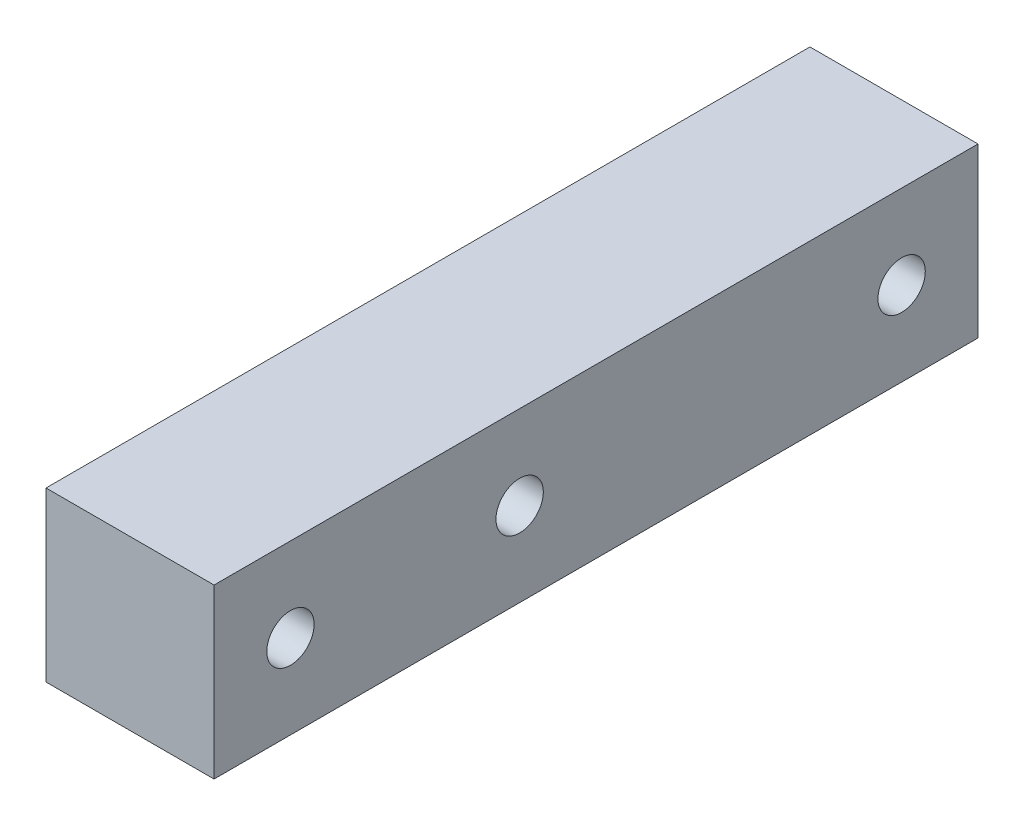
ISO-10303-21;
HEADER;
FILE_DESCRIPTION(('STEP AP214'),'2;1');
FILE_NAME('part.step','',(''),(''),'','','');
FILE_SCHEMA(('AUTOMOTIVE_DESIGN { 1 0 10303 214 1 1 1 1 }'));
ENDSEC;
DATA;
#1=APPLICATION_CONTEXT('core data for automotive mechanical design processes');
#2=APPLICATION_PROTOCOL_DEFINITION('international standard','automotive_design',2000,#1);
#3=PRODUCT_CONTEXT('',#1,'mechanical');
#4=PRODUCT('Part','Part','',(#3));
#5=PRODUCT_RELATED_PRODUCT_CATEGORY('part','',(#4));
#6=PRODUCT_DEFINITION_FORMATION('','',#4);
#7=PRODUCT_DEFINITION_CONTEXT('part definition',#1,'design');
#8=PRODUCT_DEFINITION('design','',#6,#7);
#9=PRODUCT_DEFINITION_SHAPE('','',#8);
#10=(LENGTH_UNIT() NAMED_UNIT(*) SI_UNIT(.MILLI.,.METRE.));
#11=(NAMED_UNIT(*) PLANE_ANGLE_UNIT() SI_UNIT($,.RADIAN.));
#12=(NAMED_UNIT(*) SI_UNIT($,.STERADIAN.) SOLID_ANGLE_UNIT());
#13=UNCERTAINTY_MEASURE_WITH_UNIT(LENGTH_MEASURE(1.E-05),#10,'distance_accuracy_value','');
#14=(GEOMETRIC_REPRESENTATION_CONTEXT(3) GLOBAL_UNCERTAINTY_ASSIGNED_CONTEXT((#13)) GLOBAL_UNIT_ASSIGNED_CONTEXT((#10,
#11,#12)) REPRESENTATION_CONTEXT('',''));
#15=CARTESIAN_POINT('',(0.,0.,0.));
#16=DIRECTION('',(0.,0.,1.));
#17=DIRECTION('',(1.,0.,0.));
#18=AXIS2_PLACEMENT_3D('',#15,#16,#17);
#19=CARTESIAN_POINT('',(13.97,0.,0.));
#20=DIRECTION('',(0.,0.,-1.));
#21=DIRECTION('',(-1.,0.,0.));
#22=AXIS2_PLACEMENT_3D('',#19,#20,#21);
#23=PLANE('',#22);
#24=DIRECTION('',(0.,-1.,0.));
#25=VECTOR('',#24,1.);
#26=CARTESIAN_POINT('',(0.,0.,0.));
#27=LINE('',#26,#25);
#28=CARTESIAN_POINT('',(0.,13.97,0.));
#29=VERTEX_POINT('',#28);
#30=CARTESIAN_POINT('',(0.,0.,0.));
#31=VERTEX_POINT('',#30);
#32=EDGE_CURVE('E99',#29,#31,#27,.T.);
#33=ORIENTED_EDGE('',*,*,#32,.T.);
#34=DIRECTION('',(-1.,0.,0.));
#35=VECTOR('',#34,1.);
#36=CARTESIAN_POINT('',(13.97,0.,0.));
#37=LINE('',#36,#35);
#38=CARTESIAN_POINT('',(13.97,0.,0.));
#39=VERTEX_POINT('',#38);
#40=EDGE_CURVE('E11',#39,#31,#37,.T.);
#41=ORIENTED_EDGE('',*,*,#40,.F.);
#42=DIRECTION('',(0.,-1.,0.));
#43=VECTOR('',#42,1.);
#44=CARTESIAN_POINT('',(13.97,0.,0.));
#45=LINE('',#44,#43);
#46=CARTESIAN_POINT('',(13.97,13.97,0.));
#47=VERTEX_POINT('',#46);
#48=EDGE_CURVE('E86',#47,#39,#45,.T.);
#49=ORIENTED_EDGE('',*,*,#48,.F.);
#50=DIRECTION('',(-1.,0.,0.));
#51=VECTOR('',#50,1.);
#52=CARTESIAN_POINT('',(13.97,13.97,0.));
#53=LINE('',#52,#51);
#54=EDGE_CURVE('E95',#47,#29,#53,.T.);
#55=ORIENTED_EDGE('',*,*,#54,.T.);
#56=EDGE_LOOP('',(#33,#41,#49,#55));
#57=FACE_BOUND('',#56,.T.);
#58=ADVANCED_FACE('F33',(#57),#23,.F.);
#59=CARTESIAN_POINT('',(13.97,0.,0.));
#60=DIRECTION('',(0.,1.,0.));
#61=DIRECTION('',(0.,0.,1.));
#62=AXIS2_PLACEMENT_3D('',#59,#60,#61);
#63=PLANE('',#62);
#64=DIRECTION('',(0.,0.,-1.));
#65=VECTOR('',#64,1.);
#66=CARTESIAN_POINT('',(0.,0.,0.));
#67=LINE('',#66,#65);
#68=CARTESIAN_POINT('',(0.,0.,-63.5));
#69=VERTEX_POINT('',#68);
#70=EDGE_CURVE('E90',#31,#69,#67,.T.);
#71=ORIENTED_EDGE('',*,*,#70,.T.);
#72=DIRECTION('',(-1.,0.,0.));
#73=VECTOR('',#72,1.);
#74=CARTESIAN_POINT('',(13.97,0.,-63.5));
#75=LINE('',#74,#73);
#76=CARTESIAN_POINT('',(13.97,0.,-63.5));
#77=VERTEX_POINT('',#76);
#78=EDGE_CURVE('E42',#77,#69,#75,.T.);
#79=ORIENTED_EDGE('',*,*,#78,.F.);
#80=DIRECTION('',(0.,0.,-1.));
#81=VECTOR('',#80,1.);
#82=CARTESIAN_POINT('',(13.97,0.,0.));
#83=LINE('',#82,#81);
#84=EDGE_CURVE('E81',#39,#77,#83,.T.);
#85=ORIENTED_EDGE('',*,*,#84,.F.);
#86=ORIENTED_EDGE('',*,*,#40,.T.);
#87=EDGE_LOOP('',(#71,#79,#85,#86));
#88=FACE_BOUND('',#87,.T.);
#89=ADVANCED_FACE('F89',(#88),#63,.F.);
#90=CARTESIAN_POINT('',(13.97,0.,-63.5));
#91=DIRECTION('',(0.,0.,1.));
#92=DIRECTION('',(1.,0.,0.));
#93=AXIS2_PLACEMENT_3D('',#90,#91,#92);
#94=PLANE('',#93);
#95=DIRECTION('',(0.,1.,0.));
#96=VECTOR('',#95,1.);
#97=CARTESIAN_POINT('',(0.,0.,-63.5));
#98=LINE('',#97,#96);
#99=CARTESIAN_POINT('',(0.,13.97,-63.5));
#100=VERTEX_POINT('',#99);
#101=EDGE_CURVE('E68',#69,#100,#98,.T.);
#102=ORIENTED_EDGE('',*,*,#101,.T.);
#103=DIRECTION('',(-1.,0.,0.));
#104=VECTOR('',#103,1.);
#105=CARTESIAN_POINT('',(13.97,13.97,-63.5));
#106=LINE('',#105,#104);
#107=CARTESIAN_POINT('',(13.97,13.97,-63.5));
#108=VERTEX_POINT('',#107);
#109=EDGE_CURVE('E91',#108,#100,#106,.T.);
#110=ORIENTED_EDGE('',*,*,#109,.F.);
#111=DIRECTION('',(0.,1.,0.));
#112=VECTOR('',#111,1.);
#113=CARTESIAN_POINT('',(13.97,0.,-63.5));
#114=LINE('',#113,#112);
#115=EDGE_CURVE('E84',#77,#108,#114,.T.);
#116=ORIENTED_EDGE('',*,*,#115,.F.);
#117=ORIENTED_EDGE('',*,*,#78,.T.);
#118=EDGE_LOOP('',(#102,#110,#116,#117));
#119=FACE_BOUND('',#118,.T.);
#120=ADVANCED_FACE('F93',(#119),#94,.F.);
#121=CARTESIAN_POINT('',(13.97,13.97,0.));
#122=DIRECTION('',(0.,-1.,0.));
#123=DIRECTION('',(0.,0.,-1.));
#124=AXIS2_PLACEMENT_3D('',#121,#122,#123);
#125=PLANE('',#124);
#126=DIRECTION('',(0.,0.,1.));
#127=VECTOR('',#126,1.);
#128=CARTESIAN_POINT('',(0.,13.97,0.));
#129=LINE('',#128,#127);
#130=EDGE_CURVE('E74',#100,#29,#129,.T.);
#131=ORIENTED_EDGE('',*,*,#130,.T.);
#132=ORIENTED_EDGE('',*,*,#54,.F.);
#133=DIRECTION('',(0.,0.,1.));
#134=VECTOR('',#133,1.);
#135=CARTESIAN_POINT('',(13.97,13.97,0.));
#136=LINE('',#135,#134);
#137=EDGE_CURVE('E51',#108,#47,#136,.T.);
#138=ORIENTED_EDGE('',*,*,#137,.F.);
#139=ORIENTED_EDGE('',*,*,#109,.T.);
#140=EDGE_LOOP('',(#131,#132,#138,#139));
#141=FACE_BOUND('',#140,.T.);
#142=ADVANCED_FACE('F132',(#141),#125,.F.);
#143=CARTESIAN_POINT('',(13.97,0.,0.));
#144=DIRECTION('',(-1.,0.,0.));
#145=DIRECTION('',(0.,0.,1.));
#146=AXIS2_PLACEMENT_3D('',#143,#144,#145);
#147=PLANE('',#146);
#148=CARTESIAN_POINT('',(13.97,6.985,-25.4));
#149=DIRECTION('',(1.,0.,0.));
#150=DIRECTION('',(0.,0.,-1.));
#151=AXIS2_PLACEMENT_3D('',#148,#149,#150);
#152=CIRCLE('',#151,1.9685);
#153=CARTESIAN_POINT('',(13.97,6.985,-27.3685));
#154=VERTEX_POINT('',#153);
#155=EDGE_CURVE('E122',#154,#154,#152,.T.);
#156=ORIENTED_EDGE('',*,*,#155,.F.);
#157=EDGE_LOOP('',(#156));
#158=FACE_BOUND('',#157,.T.);
#159=CARTESIAN_POINT('',(13.97,6.985,-57.15));
#160=DIRECTION('',(1.,0.,0.));
#161=DIRECTION('',(0.,0.,-1.));
#162=AXIS2_PLACEMENT_3D('',#159,#160,#161);
#163=CIRCLE('',#162,1.9685);
#164=CARTESIAN_POINT('',(13.97,6.985,-59.1185));
#165=VERTEX_POINT('',#164);
#166=EDGE_CURVE('E112',#165,#165,#163,.T.);
#167=ORIENTED_EDGE('',*,*,#166,.F.);
#168=EDGE_LOOP('',(#167));
#169=FACE_BOUND('',#168,.T.);
#170=CARTESIAN_POINT('',(13.97,6.985,-6.35));
#171=DIRECTION('',(1.,0.,0.));
#172=DIRECTION('',(0.,0.,-1.));
#173=AXIS2_PLACEMENT_3D('',#170,#171,#172);
#174=CIRCLE('',#173,1.9685);
#175=CARTESIAN_POINT('',(13.97,6.985,-8.3185));
#176=VERTEX_POINT('',#175);
#177=EDGE_CURVE('E109',#176,#176,#174,.T.);
#178=ORIENTED_EDGE('',*,*,#177,.F.);
#179=EDGE_LOOP('',(#178));
#180=FACE_BOUND('',#179,.T.);
#181=ORIENTED_EDGE('',*,*,#48,.T.);
#182=ORIENTED_EDGE('',*,*,#84,.T.);
#183=ORIENTED_EDGE('',*,*,#115,.T.);
#184=ORIENTED_EDGE('',*,*,#137,.T.);
#185=EDGE_LOOP('',(#181,#182,#183,#184));
#186=FACE_BOUND('',#185,.T.);
#187=ADVANCED_FACE('F82',(#158,#169,#180,#186),#147,.F.);
#188=CARTESIAN_POINT('',(0.,0.,0.));
#189=DIRECTION('',(-1.,0.,0.));
#190=DIRECTION('',(0.,0.,1.));
#191=AXIS2_PLACEMENT_3D('',#188,#189,#190);
#192=PLANE('',#191);
#193=CARTESIAN_POINT('',(0.,6.985,-25.4));
#194=DIRECTION('',(-1.,0.,0.));
#195=DIRECTION('',(0.,0.,1.));
#196=AXIS2_PLACEMENT_3D('',#193,#194,#195);
#197=CIRCLE('',#196,1.9685);
#198=CARTESIAN_POINT('',(0.,6.985,-23.4315));
#199=VERTEX_POINT('',#198);
#200=EDGE_CURVE('E36',#199,#199,#197,.T.);
#201=ORIENTED_EDGE('',*,*,#200,.F.);
#202=EDGE_LOOP('',(#201));
#203=FACE_BOUND('',#202,.T.);
#204=CARTESIAN_POINT('',(0.,6.985,-57.15));
#205=DIRECTION('',(-1.,0.,0.));
#206=DIRECTION('',(0.,0.,1.));
#207=AXIS2_PLACEMENT_3D('',#204,#205,#206);
#208=CIRCLE('',#207,1.9685);
#209=CARTESIAN_POINT('',(0.,6.985,-55.1815));
#210=VERTEX_POINT('',#209);
#211=EDGE_CURVE('E110',#210,#210,#208,.T.);
#212=ORIENTED_EDGE('',*,*,#211,.F.);
#213=EDGE_LOOP('',(#212));
#214=FACE_BOUND('',#213,.T.);
#215=CARTESIAN_POINT('',(0.,6.985,-6.35));
#216=DIRECTION('',(-1.,0.,0.));
#217=DIRECTION('',(0.,0.,1.));
#218=AXIS2_PLACEMENT_3D('',#215,#216,#217);
#219=CIRCLE('',#218,1.9685);
#220=CARTESIAN_POINT('',(0.,6.985,-4.3815));
#221=VERTEX_POINT('',#220);
#222=EDGE_CURVE('E102',#221,#221,#219,.T.);
#223=ORIENTED_EDGE('',*,*,#222,.F.);
#224=EDGE_LOOP('',(#223));
#225=FACE_BOUND('',#224,.T.);
#226=ORIENTED_EDGE('',*,*,#32,.F.);
#227=ORIENTED_EDGE('',*,*,#130,.F.);
#228=ORIENTED_EDGE('',*,*,#101,.F.);
#229=ORIENTED_EDGE('',*,*,#70,.F.);
#230=EDGE_LOOP('',(#226,#227,#228,#229));
#231=FACE_BOUND('',#230,.T.);
#232=ADVANCED_FACE('F131',(#203,#214,#225,#231),#192,.T.);
#233=CARTESIAN_POINT('',(-240.03,6.985,-6.35));
#234=DIRECTION('',(1.,0.,0.));
#235=DIRECTION('',(0.,0.,-1.));
#236=AXIS2_PLACEMENT_3D('',#233,#234,#235);
#237=CYLINDRICAL_SURFACE('',#236,1.9685);
#238=ORIENTED_EDGE('',*,*,#222,.T.);
#239=EDGE_LOOP('',(#238));
#240=FACE_BOUND('',#239,.T.);
#241=ORIENTED_EDGE('',*,*,#177,.T.);
#242=EDGE_LOOP('',(#241));
#243=FACE_BOUND('',#242,.T.);
#244=ADVANCED_FACE('F137',(#240,#243),#237,.F.);
#245=CARTESIAN_POINT('',(-240.03,6.985,-57.15));
#246=DIRECTION('',(1.,0.,0.));
#247=DIRECTION('',(0.,0.,-1.));
#248=AXIS2_PLACEMENT_3D('',#245,#246,#247);
#249=CYLINDRICAL_SURFACE('',#248,1.9685);
#250=ORIENTED_EDGE('',*,*,#211,.T.);
#251=EDGE_LOOP('',(#250));
#252=FACE_BOUND('',#251,.T.);
#253=ORIENTED_EDGE('',*,*,#166,.T.);
#254=EDGE_LOOP('',(#253));
#255=FACE_BOUND('',#254,.T.);
#256=ADVANCED_FACE('F139',(#252,#255),#249,.F.);
#257=CARTESIAN_POINT('',(-240.03,6.985,-25.4));
#258=DIRECTION('',(1.,0.,0.));
#259=DIRECTION('',(0.,0.,-1.));
#260=AXIS2_PLACEMENT_3D('',#257,#258,#259);
#261=CYLINDRICAL_SURFACE('',#260,1.9685);
#262=ORIENTED_EDGE('',*,*,#200,.T.);
#263=EDGE_LOOP('',(#262));
#264=FACE_BOUND('',#263,.T.);
#265=ORIENTED_EDGE('',*,*,#155,.T.);
#266=EDGE_LOOP('',(#265));
#267=FACE_BOUND('',#266,.T.);
#268=ADVANCED_FACE('F127',(#264,#267),#261,.F.);
#269=CLOSED_SHELL('',(#58,#89,#120,#142,#187,#232,#244,#256,#268));
#270=MANIFOLD_SOLID_BREP('B2',#269);
#271=ADVANCED_BREP_SHAPE_REPRESENTATION('',(#18,#270),#14);
#272=SHAPE_DEFINITION_REPRESENTATION(#9,#271);
ENDSEC;
END-ISO-10303-21;
